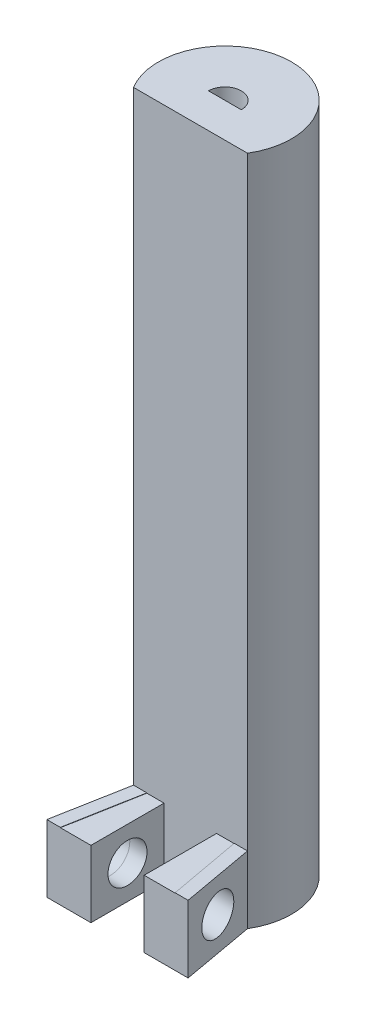
ISO-10303-21;
HEADER;
FILE_DESCRIPTION(('STEP AP214'),'2;1');
FILE_NAME('part.step','',(''),(''),'','','');
FILE_SCHEMA(('AUTOMOTIVE_DESIGN { 1 0 10303 214 1 1 1 1 }'));
ENDSEC;
DATA;
#1=APPLICATION_CONTEXT('core data for automotive mechanical design processes');
#2=APPLICATION_PROTOCOL_DEFINITION('international standard','automotive_design',2000,#1);
#3=PRODUCT_CONTEXT('',#1,'mechanical');
#4=PRODUCT('Part','Part','',(#3));
#5=PRODUCT_RELATED_PRODUCT_CATEGORY('part','',(#4));
#6=PRODUCT_DEFINITION_FORMATION('','',#4);
#7=PRODUCT_DEFINITION_CONTEXT('part definition',#1,'design');
#8=PRODUCT_DEFINITION('design','',#6,#7);
#9=PRODUCT_DEFINITION_SHAPE('','',#8);
#10=(LENGTH_UNIT() NAMED_UNIT(*) SI_UNIT(.MILLI.,.METRE.));
#11=(NAMED_UNIT(*) PLANE_ANGLE_UNIT() SI_UNIT($,.RADIAN.));
#12=(NAMED_UNIT(*) SI_UNIT($,.STERADIAN.) SOLID_ANGLE_UNIT());
#13=UNCERTAINTY_MEASURE_WITH_UNIT(LENGTH_MEASURE(1.E-05),#10,'distance_accuracy_value','');
#14=(GEOMETRIC_REPRESENTATION_CONTEXT(3) GLOBAL_UNCERTAINTY_ASSIGNED_CONTEXT((#13)) GLOBAL_UNIT_ASSIGNED_CONTEXT((#10,
#11,#12)) REPRESENTATION_CONTEXT('',''));
#15=CARTESIAN_POINT('',(0.,0.,0.));
#16=DIRECTION('',(0.,0.,1.));
#17=DIRECTION('',(1.,0.,0.));
#18=AXIS2_PLACEMENT_3D('',#15,#16,#17);
#19=CARTESIAN_POINT('',(10.8004451861737,28.448,6.53795652974117));
#20=DIRECTION('',(0.,0.,-1.));
#21=DIRECTION('',(-1.,0.,0.));
#22=AXIS2_PLACEMENT_3D('',#19,#20,#21);
#23=PLANE('',#22);
#24=DIRECTION('',(-1.,0.,0.));
#25=VECTOR('',#24,1.);
#26=CARTESIAN_POINT('',(10.8004451861737,-114.554,6.53795652974117));
#27=LINE('',#26,#25);
#28=CARTESIAN_POINT('',(-5.00994549213135,-114.554,6.53795652974117));
#29=VERTEX_POINT('',#28);
#30=CARTESIAN_POINT('',(-8.27477707509697,-114.554,6.53795652974117));
#31=VERTEX_POINT('',#30);
#32=EDGE_CURVE('E48',#29,#31,#27,.T.);
#33=ORIENTED_EDGE('',*,*,#32,.F.);
#34=DIRECTION('',(0.,1.,0.));
#35=VECTOR('',#34,1.);
#36=CARTESIAN_POINT('',(-5.00994549213135,28.448,6.53795652974117));
#37=LINE('',#36,#35);
#38=CARTESIAN_POINT('',(-5.00994549213135,-127.254,6.53795652974117));
#39=VERTEX_POINT('',#38);
#40=EDGE_CURVE('E11',#39,#29,#37,.T.);
#41=ORIENTED_EDGE('',*,*,#40,.F.);
#42=DIRECTION('',(1.,0.,0.));
#43=VECTOR('',#42,1.);
#44=CARTESIAN_POINT('',(10.8004451861737,-127.254,6.53795652974117));
#45=LINE('',#44,#43);
#46=CARTESIAN_POINT('',(4.94044133978893,-127.254,6.53795652974117));
#47=VERTEX_POINT('',#46);
#48=EDGE_CURVE('E251',#39,#47,#45,.T.);
#49=ORIENTED_EDGE('',*,*,#48,.T.);
#50=DIRECTION('',(0.,-1.,0.));
#51=VECTOR('',#50,1.);
#52=CARTESIAN_POINT('',(4.94044133978893,-114.554,6.53795652974117));
#53=LINE('',#52,#51);
#54=CARTESIAN_POINT('',(4.94044133978893,-114.554,6.53795652974117));
#55=VERTEX_POINT('',#54);
#56=EDGE_CURVE('E179',#55,#47,#53,.T.);
#57=ORIENTED_EDGE('',*,*,#56,.F.);
#58=DIRECTION('',(1.,0.,0.));
#59=VECTOR('',#58,1.);
#60=CARTESIAN_POINT('',(4.94044133978893,-114.554,6.53795652974117));
#61=LINE('',#60,#59);
#62=CARTESIAN_POINT('',(8.28788494052397,-114.554,6.53795652974117));
#63=VERTEX_POINT('',#62);
#64=EDGE_CURVE('E171',#55,#63,#61,.T.);
#65=ORIENTED_EDGE('',*,*,#64,.T.);
#66=DIRECTION('',(0.,-1.,0.));
#67=VECTOR('',#66,1.);
#68=CARTESIAN_POINT('',(8.28788494052397,-114.498809878987,6.53795652974117));
#69=LINE('',#68,#67);
#70=CARTESIAN_POINT('',(8.28788494052397,-114.498809878987,6.53795652974117));
#71=VERTEX_POINT('',#70);
#72=EDGE_CURVE('E212',#71,#63,#69,.T.);
#73=ORIENTED_EDGE('',*,*,#72,.F.);
#74=DIRECTION('',(1.,0.,0.));
#75=VECTOR('',#74,1.);
#76=CARTESIAN_POINT('',(10.8004451861737,-114.498809878987,6.53795652974117));
#77=LINE('',#76,#75);
#78=CARTESIAN_POINT('',(10.8004451861737,-114.498809878987,6.53795652974117));
#79=VERTEX_POINT('',#78);
#80=EDGE_CURVE('E203',#71,#79,#77,.T.);
#81=ORIENTED_EDGE('',*,*,#80,.T.);
#82=DIRECTION('',(0.,-1.,0.));
#83=VECTOR('',#82,1.);
#84=CARTESIAN_POINT('',(10.8004451861737,28.448,6.53795652974117));
#85=LINE('',#84,#83);
#86=CARTESIAN_POINT('',(10.8004451861737,0.,6.53795652974117));
#87=VERTEX_POINT('',#86);
#88=EDGE_CURVE('E256',#87,#79,#85,.T.);
#89=ORIENTED_EDGE('',*,*,#88,.F.);
#90=DIRECTION('',(-1.,0.,0.));
#91=VECTOR('',#90,1.);
#92=CARTESIAN_POINT('',(0.,0.,6.53795652974117));
#93=LINE('',#92,#91);
#94=CARTESIAN_POINT('',(-10.8004451861737,0.,6.53795652974117));
#95=VERTEX_POINT('',#94);
#96=EDGE_CURVE('E264',#87,#95,#93,.T.);
#97=ORIENTED_EDGE('',*,*,#96,.T.);
#98=DIRECTION('',(0.,-1.,0.));
#99=VECTOR('',#98,1.);
#100=CARTESIAN_POINT('',(-10.8004451861737,28.448,6.53795652974117));
#101=LINE('',#100,#99);
#102=CARTESIAN_POINT('',(-10.8004451861737,-114.498809878987,6.53795652974117));
#103=VERTEX_POINT('',#102);
#104=EDGE_CURVE('E255',#95,#103,#101,.T.);
#105=ORIENTED_EDGE('',*,*,#104,.T.);
#106=DIRECTION('',(1.,0.,0.));
#107=VECTOR('',#106,1.);
#108=CARTESIAN_POINT('',(-10.8004451861737,-114.498809878987,6.53795652974117));
#109=LINE('',#108,#107);
#110=CARTESIAN_POINT('',(-8.27477707509697,-114.498809878987,6.53795652974117));
#111=VERTEX_POINT('',#110);
#112=EDGE_CURVE('E226',#103,#111,#109,.T.);
#113=ORIENTED_EDGE('',*,*,#112,.T.);
#114=DIRECTION('',(0.,-1.,0.));
#115=VECTOR('',#114,1.);
#116=CARTESIAN_POINT('',(-8.27477707509697,-114.498809878987,6.53795652974117));
#117=LINE('',#116,#115);
#118=EDGE_CURVE('E238',#111,#31,#117,.T.);
#119=ORIENTED_EDGE('',*,*,#118,.T.);
#120=EDGE_LOOP('',(#33,#41,#49,#57,#65,#73,#81,#89,#97,#105,#113,#119));
#121=FACE_BOUND('',#120,.T.);
#122=ADVANCED_FACE('F33',(#121),#23,.F.);
#123=CARTESIAN_POINT('',(0.,-127.254,0.));
#124=DIRECTION('',(0.,1.,0.));
#125=DIRECTION('',(0.,0.,1.));
#126=AXIS2_PLACEMENT_3D('',#123,#124,#125);
#127=CYLINDRICAL_SURFACE('',#126,12.6251531398367);
#128=ORIENTED_EDGE('',*,*,#88,.T.);
#129=DIRECTION('',(0.,-1.,0.));
#130=VECTOR('',#129,1.);
#131=CARTESIAN_POINT('',(10.8004451861737,-114.498809878987,6.53795652974117));
#132=LINE('',#131,#130);
#133=CARTESIAN_POINT('',(10.8004451861737,-127.254,6.53795652974117));
#134=VERTEX_POINT('',#133);
#135=EDGE_CURVE('E209',#79,#134,#132,.T.);
#136=ORIENTED_EDGE('',*,*,#135,.T.);
#137=CARTESIAN_POINT('',(0.,-127.254,0.));
#138=DIRECTION('',(0.,1.,0.));
#139=DIRECTION('',(0.,0.,1.));
#140=AXIS2_PLACEMENT_3D('',#137,#138,#139);
#141=CIRCLE('',#140,12.6251531398367);
#142=CARTESIAN_POINT('',(-10.8004451861737,-127.254,6.53795652974117));
#143=VERTEX_POINT('',#142);
#144=EDGE_CURVE('E262',#134,#143,#141,.T.);
#145=ORIENTED_EDGE('',*,*,#144,.T.);
#146=DIRECTION('',(0.,-1.,0.));
#147=VECTOR('',#146,1.);
#148=CARTESIAN_POINT('',(-10.8004451861737,-114.498809878987,6.53795652974117));
#149=LINE('',#148,#147);
#150=EDGE_CURVE('E240',#103,#143,#149,.T.);
#151=ORIENTED_EDGE('',*,*,#150,.F.);
#152=ORIENTED_EDGE('',*,*,#104,.F.);
#153=CARTESIAN_POINT('',(0.,0.,0.));
#154=DIRECTION('',(0.,1.,0.));
#155=DIRECTION('',(0.,0.,1.));
#156=AXIS2_PLACEMENT_3D('',#153,#154,#155);
#157=CIRCLE('',#156,12.6251531398367);
#158=EDGE_CURVE('E259',#87,#95,#157,.T.);
#159=ORIENTED_EDGE('',*,*,#158,.F.);
#160=EDGE_LOOP('',(#128,#136,#145,#151,#152,#159));
#161=FACE_BOUND('',#160,.T.);
#162=ADVANCED_FACE('F35',(#161),#127,.T.);
#163=CARTESIAN_POINT('',(0.,-127.254,0.));
#164=DIRECTION('',(0.,1.,0.));
#165=DIRECTION('',(0.,0.,1.));
#166=AXIS2_PLACEMENT_3D('',#163,#164,#165);
#167=PLANE('',#166);
#168=ORIENTED_EDGE('',*,*,#48,.F.);
#169=DIRECTION('',(0.,0.,1.));
#170=VECTOR('',#169,1.);
#171=CARTESIAN_POINT('',(-5.00994549213136,-127.254,6.42605145082371));
#172=LINE('',#171,#170);
#173=CARTESIAN_POINT('',(-5.00994549213136,-127.254,20.3960514508237));
#174=VERTEX_POINT('',#173);
#175=EDGE_CURVE('E153',#39,#174,#172,.T.);
#176=ORIENTED_EDGE('',*,*,#175,.T.);
#177=DIRECTION('',(-1.,0.,0.));
#178=VECTOR('',#177,1.);
#179=CARTESIAN_POINT('',(-10.8004451861737,-127.254,20.3960514508237));
#180=LINE('',#179,#178);
#181=CARTESIAN_POINT('',(-13.364649968782,-127.254,20.3960514508237));
#182=VERTEX_POINT('',#181);
#183=EDGE_CURVE('E157',#174,#182,#180,.T.);
#184=ORIENTED_EDGE('',*,*,#183,.T.);
#185=DIRECTION('',(0.181944568373949,0.,-0.983308788753165));
#186=VECTOR('',#185,1.);
#187=CARTESIAN_POINT('',(-13.364649968782,-127.254,20.3960514508237));
#188=LINE('',#187,#186);
#189=EDGE_CURVE('E223',#182,#143,#188,.T.);
#190=ORIENTED_EDGE('',*,*,#189,.T.);
#191=ORIENTED_EDGE('',*,*,#144,.F.);
#192=DIRECTION('',(0.176835796111787,0.,0.984240367600065));
#193=VECTOR('',#192,1.);
#194=CARTESIAN_POINT('',(13.2655796826163,-127.254,20.2585093607326));
#195=LINE('',#194,#193);
#196=CARTESIAN_POINT('',(13.2655796826163,-127.254,20.2585093607326));
#197=VERTEX_POINT('',#196);
#198=EDGE_CURVE('E145',#134,#197,#195,.T.);
#199=ORIENTED_EDGE('',*,*,#198,.T.);
#200=DIRECTION('',(-1.,0.,0.));
#201=VECTOR('',#200,1.);
#202=CARTESIAN_POINT('',(10.8004451861737,-127.254,20.2585093607326));
#203=LINE('',#202,#201);
#204=CARTESIAN_POINT('',(4.94044133978893,-127.254,20.2585093607326));
#205=VERTEX_POINT('',#204);
#206=EDGE_CURVE('E197',#197,#205,#203,.T.);
#207=ORIENTED_EDGE('',*,*,#206,.T.);
#208=DIRECTION('',(0.,0.,-1.));
#209=VECTOR('',#208,1.);
#210=CARTESIAN_POINT('',(4.94044133978893,-127.254,20.2585093607326));
#211=LINE('',#210,#209);
#212=EDGE_CURVE('E170',#205,#47,#211,.T.);
#213=ORIENTED_EDGE('',*,*,#212,.T.);
#214=EDGE_LOOP('',(#168,#176,#184,#190,#191,#199,#207,#213));
#215=FACE_BOUND('',#214,.T.);
#216=DIRECTION('',(-1.,0.,0.));
#217=VECTOR('',#216,1.);
#218=CARTESIAN_POINT('',(-3.12616908784099,-127.254,0.));
#219=LINE('',#218,#217);
#220=CARTESIAN_POINT('',(3.09162578300214,-127.254,0.));
#221=VERTEX_POINT('',#220);
#222=CARTESIAN_POINT('',(-3.12616908784099,-127.254,0.));
#223=VERTEX_POINT('',#222);
#224=EDGE_CURVE('E245',#221,#223,#219,.T.);
#225=ORIENTED_EDGE('',*,*,#224,.F.);
#226=CARTESIAN_POINT('',(-0.0172716524194207,-127.254,0.));
#227=DIRECTION('',(0.,-1.,0.));
#228=DIRECTION('',(0.,0.,1.));
#229=AXIS2_PLACEMENT_3D('',#226,#227,#228);
#230=CIRCLE('',#229,3.10889743542157);
#231=EDGE_CURVE('E237',#223,#221,#230,.T.);
#232=ORIENTED_EDGE('',*,*,#231,.F.);
#233=EDGE_LOOP('',(#225,#232));
#234=FACE_BOUND('',#233,.T.);
#235=ADVANCED_FACE('F283',(#215,#234),#167,.F.);
#236=CARTESIAN_POINT('',(0.,0.,0.));
#237=DIRECTION('',(0.,1.,0.));
#238=DIRECTION('',(0.,0.,1.));
#239=AXIS2_PLACEMENT_3D('',#236,#237,#238);
#240=PLANE('',#239);
#241=CARTESIAN_POINT('',(-0.0172716524194207,0.,0.));
#242=DIRECTION('',(0.,1.,0.));
#243=DIRECTION('',(0.,0.,1.));
#244=AXIS2_PLACEMENT_3D('',#241,#242,#243);
#245=CIRCLE('',#244,3.10889743542157);
#246=CARTESIAN_POINT('',(3.09162578300214,0.,0.));
#247=VERTEX_POINT('',#246);
#248=CARTESIAN_POINT('',(-3.12616908784099,0.,0.));
#249=VERTEX_POINT('',#248);
#250=EDGE_CURVE('E41',#247,#249,#245,.T.);
#251=ORIENTED_EDGE('',*,*,#250,.F.);
#252=DIRECTION('',(1.,0.,0.));
#253=VECTOR('',#252,1.);
#254=CARTESIAN_POINT('',(0.,0.,0.));
#255=LINE('',#254,#253);
#256=EDGE_CURVE('E268',#249,#247,#255,.T.);
#257=ORIENTED_EDGE('',*,*,#256,.F.);
#258=EDGE_LOOP('',(#251,#257));
#259=FACE_BOUND('',#258,.T.);
#260=ORIENTED_EDGE('',*,*,#96,.F.);
#261=ORIENTED_EDGE('',*,*,#158,.T.);
#262=EDGE_LOOP('',(#260,#261));
#263=FACE_BOUND('',#262,.T.);
#264=ADVANCED_FACE('F276',(#259,#263),#240,.T.);
#265=CARTESIAN_POINT('',(-0.0172716524194207,13.827655766843,0.));
#266=DIRECTION('',(0.,-1.,0.));
#267=DIRECTION('',(0.,0.,-1.));
#268=AXIS2_PLACEMENT_3D('',#265,#266,#267);
#269=CYLINDRICAL_SURFACE('',#268,3.10889743542157);
#270=ORIENTED_EDGE('',*,*,#250,.T.);
#271=DIRECTION('',(0.,-1.,0.));
#272=VECTOR('',#271,1.);
#273=CARTESIAN_POINT('',(-3.12616908784099,13.827655766843,0.));
#274=LINE('',#273,#272);
#275=EDGE_CURVE('E249',#249,#223,#274,.T.);
#276=ORIENTED_EDGE('',*,*,#275,.T.);
#277=ORIENTED_EDGE('',*,*,#231,.T.);
#278=DIRECTION('',(0.,-1.,0.));
#279=VECTOR('',#278,1.);
#280=CARTESIAN_POINT('',(3.09162578300214,13.827655766843,0.));
#281=LINE('',#280,#279);
#282=EDGE_CURVE('E248',#247,#221,#281,.T.);
#283=ORIENTED_EDGE('',*,*,#282,.F.);
#284=EDGE_LOOP('',(#270,#276,#277,#283));
#285=FACE_BOUND('',#284,.T.);
#286=ADVANCED_FACE('F274',(#285),#269,.F.);
#287=CARTESIAN_POINT('',(-3.12616908784099,13.827655766843,0.));
#288=DIRECTION('',(0.,0.,1.));
#289=DIRECTION('',(1.,0.,0.));
#290=AXIS2_PLACEMENT_3D('',#287,#288,#289);
#291=PLANE('',#290);
#292=ORIENTED_EDGE('',*,*,#256,.T.);
#293=ORIENTED_EDGE('',*,*,#282,.T.);
#294=ORIENTED_EDGE('',*,*,#224,.T.);
#295=ORIENTED_EDGE('',*,*,#275,.F.);
#296=EDGE_LOOP('',(#292,#293,#294,#295));
#297=FACE_BOUND('',#296,.T.);
#298=ADVANCED_FACE('F279',(#297),#291,.F.);
#299=CARTESIAN_POINT('',(-10.8004451861737,-114.498809878987,20.3960514508237));
#300=DIRECTION('',(0.,0.,1.));
#301=DIRECTION('',(1.,0.,0.));
#302=AXIS2_PLACEMENT_3D('',#299,#300,#301);
#303=PLANE('',#302);
#304=ORIENTED_EDGE('',*,*,#183,.F.);
#305=DIRECTION('',(0.,-1.,0.));
#306=VECTOR('',#305,1.);
#307=CARTESIAN_POINT('',(-5.00994549213136,-114.554,20.3960514508237));
#308=LINE('',#307,#306);
#309=CARTESIAN_POINT('',(-5.00994549213136,-114.554,20.3960514508237));
#310=VERTEX_POINT('',#309);
#311=EDGE_CURVE('E151',#310,#174,#308,.T.);
#312=ORIENTED_EDGE('',*,*,#311,.F.);
#313=DIRECTION('',(-1.,0.,0.));
#314=VECTOR('',#313,1.);
#315=CARTESIAN_POINT('',(-10.8004451861737,-114.554,20.3960514508237));
#316=LINE('',#315,#314);
#317=CARTESIAN_POINT('',(-10.8004451861737,-114.554,20.3960514508237));
#318=VERTEX_POINT('',#317);
#319=EDGE_CURVE('E137',#310,#318,#316,.T.);
#320=ORIENTED_EDGE('',*,*,#319,.T.);
#321=DIRECTION('',(0.,-1.,0.));
#322=VECTOR('',#321,1.);
#323=CARTESIAN_POINT('',(-10.8004451861737,-114.498809878987,20.3960514508237));
#324=LINE('',#323,#322);
#325=CARTESIAN_POINT('',(-10.8004451861737,-114.498809878987,20.3960514508237));
#326=VERTEX_POINT('',#325);
#327=EDGE_CURVE('E235',#326,#318,#324,.T.);
#328=ORIENTED_EDGE('',*,*,#327,.F.);
#329=DIRECTION('',(-1.,0.,0.));
#330=VECTOR('',#329,1.);
#331=CARTESIAN_POINT('',(-10.8004451861737,-114.498809878987,20.3960514508237));
#332=LINE('',#331,#330);
#333=CARTESIAN_POINT('',(-13.364649968782,-114.498809878987,20.3960514508237));
#334=VERTEX_POINT('',#333);
#335=EDGE_CURVE('E219',#326,#334,#332,.T.);
#336=ORIENTED_EDGE('',*,*,#335,.T.);
#337=DIRECTION('',(0.,-1.,0.));
#338=VECTOR('',#337,1.);
#339=CARTESIAN_POINT('',(-13.364649968782,-114.498809878987,20.3960514508237));
#340=LINE('',#339,#338);
#341=EDGE_CURVE('E231',#334,#182,#340,.T.);
#342=ORIENTED_EDGE('',*,*,#341,.T.);
#343=EDGE_LOOP('',(#304,#312,#320,#328,#336,#342));
#344=FACE_BOUND('',#343,.T.);
#345=ADVANCED_FACE('F155',(#344),#303,.T.);
#346=CARTESIAN_POINT('',(-8.27477707509697,-114.498809878987,6.53795652974117));
#347=DIRECTION('',(0.983794676166938,0.,0.179298731578309));
#348=DIRECTION('',(0.179298731578309,0.,-0.983794676166938));
#349=AXIS2_PLACEMENT_3D('',#346,#347,#348);
#350=PLANE('',#349);
#351=DIRECTION('',(0.179298731578309,0.,-0.983794676166938));
#352=VECTOR('',#351,1.);
#353=CARTESIAN_POINT('',(-8.27477707509697,-114.554,6.53795652974117));
#354=LINE('',#353,#352);
#355=EDGE_CURVE('E141',#318,#31,#354,.T.);
#356=ORIENTED_EDGE('',*,*,#355,.T.);
#357=ORIENTED_EDGE('',*,*,#118,.F.);
#358=DIRECTION('',(-0.179298731578309,0.,0.983794676166938));
#359=VECTOR('',#358,1.);
#360=CARTESIAN_POINT('',(-8.27477707509697,-114.498809878987,6.53795652974117));
#361=LINE('',#360,#359);
#362=EDGE_CURVE('E228',#111,#326,#361,.T.);
#363=ORIENTED_EDGE('',*,*,#362,.T.);
#364=ORIENTED_EDGE('',*,*,#327,.T.);
#365=EDGE_LOOP('',(#356,#357,#363,#364));
#366=FACE_BOUND('',#365,.T.);
#367=ADVANCED_FACE('F303',(#366),#350,.T.);
#368=CARTESIAN_POINT('',(-13.364649968782,-114.498809878987,20.3960514508237));
#369=DIRECTION('',(-0.983308788753165,0.,-0.181944568373949));
#370=DIRECTION('',(-0.181944568373949,0.,0.983308788753166));
#371=AXIS2_PLACEMENT_3D('',#368,#369,#370);
#372=PLANE('',#371);
#373=CARTESIAN_POINT('',(-12.0825475774778,-120.904,13.4670039902825));
#374=DIRECTION('',(-0.983308788753165,0.,-0.181944568373949));
#375=DIRECTION('',(0.181944568373949,0.,-0.983308788753166));
#376=AXIS2_PLACEMENT_3D('',#373,#374,#375);
#377=ELLIPSE('',#376,3.86599024824269,3.80146218833107);
#378=CARTESIAN_POINT('',(-11.3791516504234,-120.904,9.66554180195138));
#379=VERTEX_POINT('',#378);
#380=EDGE_CURVE('E182',#379,#379,#377,.T.);
#381=ORIENTED_EDGE('',*,*,#380,.F.);
#382=EDGE_LOOP('',(#381));
#383=FACE_BOUND('',#382,.T.);
#384=ORIENTED_EDGE('',*,*,#189,.F.);
#385=ORIENTED_EDGE('',*,*,#341,.F.);
#386=DIRECTION('',(0.181944568373949,0.,-0.983308788753165));
#387=VECTOR('',#386,1.);
#388=CARTESIAN_POINT('',(-13.364649968782,-114.498809878987,20.3960514508237));
#389=LINE('',#388,#387);
#390=EDGE_CURVE('E222',#334,#103,#389,.T.);
#391=ORIENTED_EDGE('',*,*,#390,.T.);
#392=ORIENTED_EDGE('',*,*,#150,.T.);
#393=EDGE_LOOP('',(#384,#385,#391,#392));
#394=FACE_BOUND('',#393,.T.);
#395=ADVANCED_FACE('F304',(#383,#394),#372,.T.);
#396=CARTESIAN_POINT('',(0.,-114.498809878987,0.));
#397=DIRECTION('',(0.,1.,0.));
#398=DIRECTION('',(0.,0.,1.));
#399=AXIS2_PLACEMENT_3D('',#396,#397,#398);
#400=PLANE('',#399);
#401=ORIENTED_EDGE('',*,*,#335,.F.);
#402=ORIENTED_EDGE('',*,*,#362,.F.);
#403=ORIENTED_EDGE('',*,*,#112,.F.);
#404=ORIENTED_EDGE('',*,*,#390,.F.);
#405=EDGE_LOOP('',(#401,#402,#403,#404));
#406=FACE_BOUND('',#405,.T.);
#407=ADVANCED_FACE('F307',(#406),#400,.T.);
#408=CARTESIAN_POINT('',(13.2655796826163,-114.498809878987,20.2585093607326));
#409=DIRECTION('',(0.984240367600065,0.,-0.176835796111787));
#410=DIRECTION('',(-0.176835796111787,0.,-0.984240367600065));
#411=AXIS2_PLACEMENT_3D('',#408,#409,#410);
#412=PLANE('',#411);
#413=CARTESIAN_POINT('',(12.033012434395,-120.904,13.3982329452369));
#414=DIRECTION('',(0.984240367600065,0.,-0.176835796111787));
#415=DIRECTION('',(-0.176835796111787,0.,-0.984240367600065));
#416=AXIS2_PLACEMENT_3D('',#413,#414,#415);
#417=ELLIPSE('',#416,3.75362531531886,3.69446956018234);
#418=CARTESIAN_POINT('',(11.3692371134552,-120.904,9.70376338505455));
#419=VERTEX_POINT('',#418);
#420=EDGE_CURVE('E159',#419,#419,#417,.T.);
#421=ORIENTED_EDGE('',*,*,#420,.F.);
#422=EDGE_LOOP('',(#421));
#423=FACE_BOUND('',#422,.T.);
#424=ORIENTED_EDGE('',*,*,#198,.F.);
#425=ORIENTED_EDGE('',*,*,#135,.F.);
#426=DIRECTION('',(0.176835796111787,0.,0.984240367600065));
#427=VECTOR('',#426,1.);
#428=CARTESIAN_POINT('',(13.2655796826163,-114.498809878987,20.2585093607326));
#429=LINE('',#428,#427);
#430=CARTESIAN_POINT('',(13.2655796826163,-114.498809878987,20.2585093607326));
#431=VERTEX_POINT('',#430);
#432=EDGE_CURVE('E193',#79,#431,#429,.T.);
#433=ORIENTED_EDGE('',*,*,#432,.T.);
#434=DIRECTION('',(0.,-1.,0.));
#435=VECTOR('',#434,1.);
#436=CARTESIAN_POINT('',(13.2655796826163,-114.498809878987,20.2585093607326));
#437=LINE('',#436,#435);
#438=EDGE_CURVE('E205',#431,#197,#437,.T.);
#439=ORIENTED_EDGE('',*,*,#438,.T.);
#440=EDGE_LOOP('',(#424,#425,#433,#439));
#441=FACE_BOUND('',#440,.T.);
#442=ADVANCED_FACE('F314',(#423,#441),#412,.T.);
#443=CARTESIAN_POINT('',(8.28788494052397,-114.498809878987,6.53795652974117));
#444=DIRECTION('',(-0.983643088523978,0.,0.180128494134074));
#445=DIRECTION('',(0.180128494134074,0.,0.983643088523978));
#446=AXIS2_PLACEMENT_3D('',#443,#444,#445);
#447=PLANE('',#446);
#448=DIRECTION('',(0.180128494134073,0.,0.983643088523978));
#449=VECTOR('',#448,1.);
#450=CARTESIAN_POINT('',(8.28788494052397,-114.554,6.53795652974117));
#451=LINE('',#450,#449);
#452=CARTESIAN_POINT('',(10.8004451861737,-114.554,20.2585093607326));
#453=VERTEX_POINT('',#452);
#454=EDGE_CURVE('E187',#63,#453,#451,.T.);
#455=ORIENTED_EDGE('',*,*,#454,.T.);
#456=DIRECTION('',(0.,-1.,0.));
#457=VECTOR('',#456,1.);
#458=CARTESIAN_POINT('',(10.8004451861737,-114.498809878987,20.2585093607326));
#459=LINE('',#458,#457);
#460=CARTESIAN_POINT('',(10.8004451861737,-114.498809878987,20.2585093607326));
#461=VERTEX_POINT('',#460);
#462=EDGE_CURVE('E215',#461,#453,#459,.T.);
#463=ORIENTED_EDGE('',*,*,#462,.F.);
#464=DIRECTION('',(-0.180128494134073,0.,-0.983643088523978));
#465=VECTOR('',#464,1.);
#466=CARTESIAN_POINT('',(8.28788494052397,-114.498809878987,6.53795652974117));
#467=LINE('',#466,#465);
#468=EDGE_CURVE('E200',#461,#71,#467,.T.);
#469=ORIENTED_EDGE('',*,*,#468,.T.);
#470=ORIENTED_EDGE('',*,*,#72,.T.);
#471=EDGE_LOOP('',(#455,#463,#469,#470));
#472=FACE_BOUND('',#471,.T.);
#473=ADVANCED_FACE('F318',(#472),#447,.T.);
#474=CARTESIAN_POINT('',(10.8004451861737,-114.498809878987,20.2585093607326));
#475=DIRECTION('',(0.,0.,1.));
#476=DIRECTION('',(1.,0.,0.));
#477=AXIS2_PLACEMENT_3D('',#474,#475,#476);
#478=PLANE('',#477);
#479=ORIENTED_EDGE('',*,*,#206,.F.);
#480=ORIENTED_EDGE('',*,*,#438,.F.);
#481=DIRECTION('',(-1.,0.,0.));
#482=VECTOR('',#481,1.);
#483=CARTESIAN_POINT('',(10.8004451861737,-114.498809878987,20.2585093607326));
#484=LINE('',#483,#482);
#485=EDGE_CURVE('E196',#431,#461,#484,.T.);
#486=ORIENTED_EDGE('',*,*,#485,.T.);
#487=ORIENTED_EDGE('',*,*,#462,.T.);
#488=DIRECTION('',(1.,0.,0.));
#489=VECTOR('',#488,1.);
#490=CARTESIAN_POINT('',(8.28788494052397,-114.554,20.2585093607326));
#491=LINE('',#490,#489);
#492=CARTESIAN_POINT('',(4.94044133978893,-114.554,20.2585093607326));
#493=VERTEX_POINT('',#492);
#494=EDGE_CURVE('E190',#493,#453,#491,.T.);
#495=ORIENTED_EDGE('',*,*,#494,.F.);
#496=DIRECTION('',(0.,-1.,0.));
#497=VECTOR('',#496,1.);
#498=CARTESIAN_POINT('',(4.94044133978893,-114.554,20.2585093607326));
#499=LINE('',#498,#497);
#500=EDGE_CURVE('E176',#493,#205,#499,.T.);
#501=ORIENTED_EDGE('',*,*,#500,.T.);
#502=EDGE_LOOP('',(#479,#480,#486,#487,#495,#501));
#503=FACE_BOUND('',#502,.T.);
#504=ADVANCED_FACE('F320',(#503),#478,.T.);
#505=CARTESIAN_POINT('',(0.,-114.498809878987,0.));
#506=DIRECTION('',(0.,1.,0.));
#507=DIRECTION('',(0.,0.,1.));
#508=AXIS2_PLACEMENT_3D('',#505,#506,#507);
#509=PLANE('',#508);
#510=ORIENTED_EDGE('',*,*,#432,.F.);
#511=ORIENTED_EDGE('',*,*,#80,.F.);
#512=ORIENTED_EDGE('',*,*,#468,.F.);
#513=ORIENTED_EDGE('',*,*,#485,.F.);
#514=EDGE_LOOP('',(#510,#511,#512,#513));
#515=FACE_BOUND('',#514,.T.);
#516=ADVANCED_FACE('F323',(#515),#509,.T.);
#517=CARTESIAN_POINT('',(0.,-114.554,0.));
#518=DIRECTION('',(0.,1.,0.));
#519=DIRECTION('',(0.,0.,1.));
#520=AXIS2_PLACEMENT_3D('',#517,#518,#519);
#521=PLANE('',#520);
#522=ORIENTED_EDGE('',*,*,#355,.F.);
#523=ORIENTED_EDGE('',*,*,#319,.F.);
#524=DIRECTION('',(0.,0.,1.));
#525=VECTOR('',#524,1.);
#526=CARTESIAN_POINT('',(-5.00994549213136,-114.554,6.42605145082371));
#527=LINE('',#526,#525);
#528=EDGE_CURVE('E140',#29,#310,#527,.T.);
#529=ORIENTED_EDGE('',*,*,#528,.F.);
#530=ORIENTED_EDGE('',*,*,#32,.T.);
#531=EDGE_LOOP('',(#522,#523,#529,#530));
#532=FACE_BOUND('',#531,.T.);
#533=ADVANCED_FACE('F139',(#532),#521,.T.);
#534=CARTESIAN_POINT('',(0.,-114.554,0.));
#535=DIRECTION('',(0.,1.,0.));
#536=DIRECTION('',(0.,0.,1.));
#537=AXIS2_PLACEMENT_3D('',#534,#535,#536);
#538=PLANE('',#537);
#539=ORIENTED_EDGE('',*,*,#454,.F.);
#540=ORIENTED_EDGE('',*,*,#64,.F.);
#541=DIRECTION('',(0.,0.,-1.));
#542=VECTOR('',#541,1.);
#543=CARTESIAN_POINT('',(4.94044133978893,-114.554,20.2585093607326));
#544=LINE('',#543,#542);
#545=EDGE_CURVE('E173',#493,#55,#544,.T.);
#546=ORIENTED_EDGE('',*,*,#545,.F.);
#547=ORIENTED_EDGE('',*,*,#494,.T.);
#548=EDGE_LOOP('',(#539,#540,#546,#547));
#549=FACE_BOUND('',#548,.T.);
#550=ADVANCED_FACE('F333',(#549),#538,.T.);
#551=CARTESIAN_POINT('',(-19.704777075097,-120.904,13.4670039902825));
#552=DIRECTION('',(1.,0.,0.));
#553=DIRECTION('',(0.,0.,-1.));
#554=AXIS2_PLACEMENT_3D('',#551,#552,#553);
#555=CYLINDRICAL_SURFACE('',#554,3.80146218833107);
#556=ORIENTED_EDGE('',*,*,#380,.T.);
#557=EDGE_LOOP('',(#556));
#558=FACE_BOUND('',#557,.T.);
#559=CARTESIAN_POINT('',(-8.27477707509697,-120.904,13.4670039902825));
#560=DIRECTION('',(1.,0.,0.));
#561=DIRECTION('',(0.,0.,-1.));
#562=AXIS2_PLACEMENT_3D('',#559,#560,#561);
#563=CIRCLE('',#562,3.80146218833107);
#564=CARTESIAN_POINT('',(-8.27477707509697,-120.904,9.66554180195138));
#565=VERTEX_POINT('',#564);
#566=EDGE_CURVE('E152',#565,#565,#563,.F.);
#567=ORIENTED_EDGE('',*,*,#566,.F.);
#568=EDGE_LOOP('',(#567));
#569=FACE_BOUND('',#568,.T.);
#570=ADVANCED_FACE('F336',(#558,#569),#555,.F.);
#571=CARTESIAN_POINT('',(4.94044133978893,-114.554,20.2585093607326));
#572=DIRECTION('',(-1.,0.,0.));
#573=DIRECTION('',(0.,0.,1.));
#574=AXIS2_PLACEMENT_3D('',#571,#572,#573);
#575=PLANE('',#574);
#576=CARTESIAN_POINT('',(4.94044133978893,-120.904,13.3982329452369));
#577=DIRECTION('',(-1.,0.,0.));
#578=DIRECTION('',(0.,0.,1.));
#579=AXIS2_PLACEMENT_3D('',#576,#577,#578);
#580=CIRCLE('',#579,3.69446956018234);
#581=CARTESIAN_POINT('',(4.94044133978893,-120.904,17.0927025054192));
#582=VERTEX_POINT('',#581);
#583=EDGE_CURVE('E163',#582,#582,#580,.T.);
#584=ORIENTED_EDGE('',*,*,#583,.F.);
#585=EDGE_LOOP('',(#584));
#586=FACE_BOUND('',#585,.T.);
#587=ORIENTED_EDGE('',*,*,#212,.F.);
#588=ORIENTED_EDGE('',*,*,#500,.F.);
#589=ORIENTED_EDGE('',*,*,#545,.T.);
#590=ORIENTED_EDGE('',*,*,#56,.T.);
#591=EDGE_LOOP('',(#587,#588,#589,#590));
#592=FACE_BOUND('',#591,.T.);
#593=ADVANCED_FACE('F340',(#586,#592),#575,.T.);
#594=CARTESIAN_POINT('',(-8.27477707509697,-127.254,6.42605145082371));
#595=DIRECTION('',(1.,0.,0.));
#596=DIRECTION('',(0.,0.,-1.));
#597=AXIS2_PLACEMENT_3D('',#594,#595,#596);
#598=PLANE('',#597);
#599=CARTESIAN_POINT('',(-8.27477707509697,-120.904,13.4670039902824));
#600=DIRECTION('',(1.,0.,0.));
#601=DIRECTION('',(0.,0.,-1.));
#602=AXIS2_PLACEMENT_3D('',#599,#600,#601);
#603=CIRCLE('',#602,3.70023588659539);
#604=CARTESIAN_POINT('',(-8.27477707509697,-120.904,9.76676810368705));
#605=VERTEX_POINT('',#604);
#606=EDGE_CURVE('E367',#605,#605,#603,.T.);
#607=ORIENTED_EDGE('',*,*,#606,.T.);
#608=EDGE_LOOP('',(#607));
#609=FACE_BOUND('',#608,.T.);
#610=ORIENTED_EDGE('',*,*,#566,.T.);
#611=EDGE_LOOP('',(#610));
#612=FACE_BOUND('',#611,.T.);
#613=ADVANCED_FACE('F344',(#609,#612),#598,.F.);
#614=CARTESIAN_POINT('',(-5.00994549213136,-114.554,6.42605145082371));
#615=DIRECTION('',(-1.,0.,0.));
#616=DIRECTION('',(0.,0.,1.));
#617=AXIS2_PLACEMENT_3D('',#614,#615,#616);
#618=PLANE('',#617);
#619=CARTESIAN_POINT('',(-5.00994549213136,-120.904,13.4670039902824));
#620=DIRECTION('',(1.,0.,0.));
#621=DIRECTION('',(0.,0.,-1.));
#622=AXIS2_PLACEMENT_3D('',#619,#620,#621);
#623=CIRCLE('',#622,3.70023588659539);
#624=CARTESIAN_POINT('',(-5.00994549213136,-120.904,9.76676810368705));
#625=VERTEX_POINT('',#624);
#626=EDGE_CURVE('E364',#625,#625,#623,.T.);
#627=ORIENTED_EDGE('',*,*,#626,.F.);
#628=EDGE_LOOP('',(#627));
#629=FACE_BOUND('',#628,.T.);
#630=ORIENTED_EDGE('',*,*,#175,.F.);
#631=ORIENTED_EDGE('',*,*,#40,.T.);
#632=ORIENTED_EDGE('',*,*,#528,.T.);
#633=ORIENTED_EDGE('',*,*,#311,.T.);
#634=EDGE_LOOP('',(#630,#631,#632,#633));
#635=FACE_BOUND('',#634,.T.);
#636=ADVANCED_FACE('F150',(#629,#635),#618,.F.);
#637=CARTESIAN_POINT('',(50.152441339789,-120.904,13.3982329452369));
#638=DIRECTION('',(-1.,0.,0.));
#639=DIRECTION('',(0.,0.,1.));
#640=AXIS2_PLACEMENT_3D('',#637,#638,#639);
#641=CYLINDRICAL_SURFACE('',#640,3.69446956018234);
#642=ORIENTED_EDGE('',*,*,#420,.T.);
#643=EDGE_LOOP('',(#642));
#644=FACE_BOUND('',#643,.T.);
#645=ORIENTED_EDGE('',*,*,#583,.T.);
#646=EDGE_LOOP('',(#645));
#647=FACE_BOUND('',#646,.T.);
#648=ADVANCED_FACE('F351',(#644,#647),#641,.F.);
#649=CARTESIAN_POINT('',(-33.7119454921314,-120.904,13.4670039902824));
#650=DIRECTION('',(1.,0.,0.));
#651=DIRECTION('',(0.,0.,-1.));
#652=AXIS2_PLACEMENT_3D('',#649,#650,#651);
#653=CYLINDRICAL_SURFACE('',#652,3.70023588659539);
#654=ORIENTED_EDGE('',*,*,#626,.T.);
#655=EDGE_LOOP('',(#654));
#656=FACE_BOUND('',#655,.T.);
#657=ORIENTED_EDGE('',*,*,#606,.F.);
#658=EDGE_LOOP('',(#657));
#659=FACE_BOUND('',#658,.T.);
#660=ADVANCED_FACE('F355',(#656,#659),#653,.F.);
#661=CLOSED_SHELL('',(#122,#162,#235,#264,#286,#298,#345,#367,#395,#407,#442,#473,#504,#516,
#533,#550,#570,#593,#613,#636,#648,#660));
#662=MANIFOLD_SOLID_BREP('B2',#661);
#663=ADVANCED_BREP_SHAPE_REPRESENTATION('',(#18,#662),#14);
#664=SHAPE_DEFINITION_REPRESENTATION(#9,#663);
ENDSEC;
END-ISO-10303-21;
